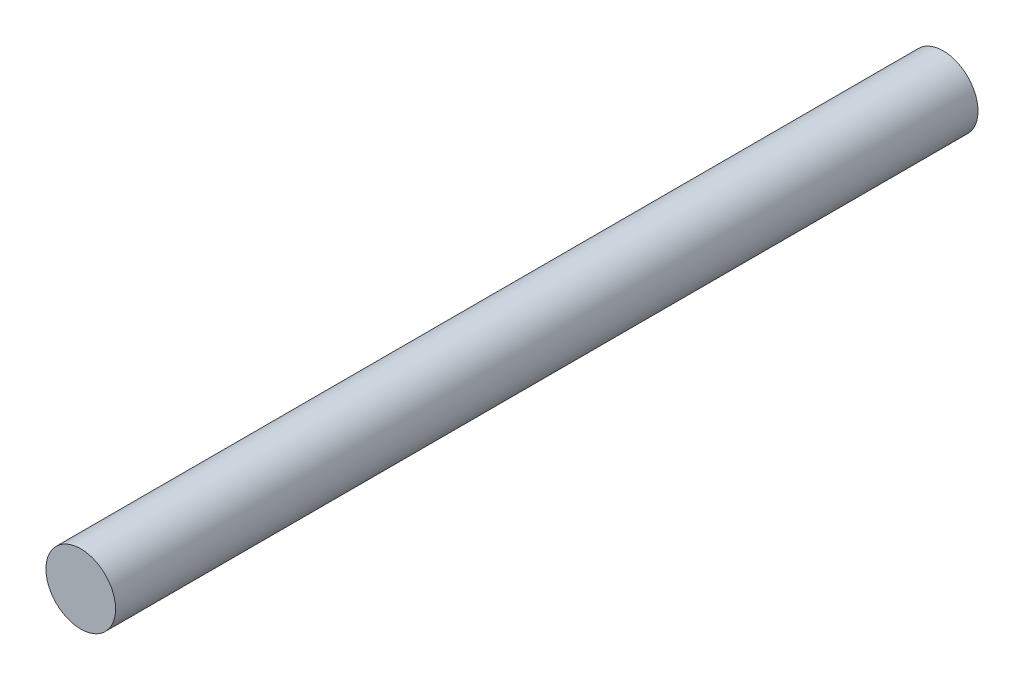
ISO-10303-21;
HEADER;
FILE_DESCRIPTION(('STEP AP214'),'2;1');
FILE_NAME('part.step','',(''),(''),'','','');
FILE_SCHEMA(('AUTOMOTIVE_DESIGN { 1 0 10303 214 1 1 1 1 }'));
ENDSEC;
DATA;
#1=APPLICATION_CONTEXT('core data for automotive mechanical design processes');
#2=APPLICATION_PROTOCOL_DEFINITION('international standard','automotive_design',2000,#1);
#3=PRODUCT_CONTEXT('',#1,'mechanical');
#4=PRODUCT('Part','Part','',(#3));
#5=PRODUCT_RELATED_PRODUCT_CATEGORY('part','',(#4));
#6=PRODUCT_DEFINITION_FORMATION('','',#4);
#7=PRODUCT_DEFINITION_CONTEXT('part definition',#1,'design');
#8=PRODUCT_DEFINITION('design','',#6,#7);
#9=PRODUCT_DEFINITION_SHAPE('','',#8);
#10=(LENGTH_UNIT() NAMED_UNIT(*) SI_UNIT(.MILLI.,.METRE.));
#11=(NAMED_UNIT(*) PLANE_ANGLE_UNIT() SI_UNIT($,.RADIAN.));
#12=(NAMED_UNIT(*) SI_UNIT($,.STERADIAN.) SOLID_ANGLE_UNIT());
#13=UNCERTAINTY_MEASURE_WITH_UNIT(LENGTH_MEASURE(1.E-05),#10,'distance_accuracy_value','');
#14=(GEOMETRIC_REPRESENTATION_CONTEXT(3) GLOBAL_UNCERTAINTY_ASSIGNED_CONTEXT((#13)) GLOBAL_UNIT_ASSIGNED_CONTEXT((#10,
#11,#12)) REPRESENTATION_CONTEXT('',''));
#15=CARTESIAN_POINT('',(0.,0.,0.));
#16=DIRECTION('',(0.,0.,1.));
#17=DIRECTION('',(1.,0.,0.));
#18=AXIS2_PLACEMENT_3D('',#15,#16,#17);
#19=CARTESIAN_POINT('',(0.,0.,73.1));
#20=DIRECTION('',(0.,0.,-1.));
#21=DIRECTION('',(-1.,0.,0.));
#22=AXIS2_PLACEMENT_3D('',#19,#20,#21);
#23=CYLINDRICAL_SURFACE('',#22,2.95);
#24=CARTESIAN_POINT('',(0.,0.,73.1));
#25=DIRECTION('',(0.,0.,1.));
#26=DIRECTION('',(1.,0.,0.));
#27=AXIS2_PLACEMENT_3D('',#24,#25,#26);
#28=CIRCLE('',#27,2.95);
#29=CARTESIAN_POINT('',(2.95,0.,73.1));
#30=VERTEX_POINT('',#29);
#31=EDGE_CURVE('E10',#30,#30,#28,.T.);
#32=ORIENTED_EDGE('',*,*,#31,.F.);
#33=EDGE_LOOP('',(#32));
#34=FACE_BOUND('',#33,.T.);
#35=CARTESIAN_POINT('',(0.,0.,0.));
#36=DIRECTION('',(0.,0.,1.));
#37=DIRECTION('',(1.,0.,0.));
#38=AXIS2_PLACEMENT_3D('',#35,#36,#37);
#39=CIRCLE('',#38,2.95);
#40=CARTESIAN_POINT('',(2.95,0.,0.));
#41=VERTEX_POINT('',#40);
#42=EDGE_CURVE('E33',#41,#41,#39,.T.);
#43=ORIENTED_EDGE('',*,*,#42,.T.);
#44=EDGE_LOOP('',(#43));
#45=FACE_BOUND('',#44,.T.);
#46=ADVANCED_FACE('F30',(#34,#45),#23,.T.);
#47=CARTESIAN_POINT('',(0.,0.,73.1));
#48=DIRECTION('',(0.,0.,1.));
#49=DIRECTION('',(1.,0.,0.));
#50=AXIS2_PLACEMENT_3D('',#47,#48,#49);
#51=PLANE('',#50);
#52=ORIENTED_EDGE('',*,*,#31,.T.);
#53=EDGE_LOOP('',(#52));
#54=FACE_BOUND('',#53,.T.);
#55=ADVANCED_FACE('F45',(#54),#51,.T.);
#56=CARTESIAN_POINT('',(0.,0.,0.));
#57=DIRECTION('',(0.,0.,1.));
#58=DIRECTION('',(1.,0.,0.));
#59=AXIS2_PLACEMENT_3D('',#56,#57,#58);
#60=PLANE('',#59);
#61=ORIENTED_EDGE('',*,*,#42,.F.);
#62=EDGE_LOOP('',(#61));
#63=FACE_BOUND('',#62,.T.);
#64=ADVANCED_FACE('F43',(#63),#60,.F.);
#65=CLOSED_SHELL('',(#46,#55,#64));
#66=MANIFOLD_SOLID_BREP('B2',#65);
#67=ADVANCED_BREP_SHAPE_REPRESENTATION('',(#18,#66),#14);
#68=SHAPE_DEFINITION_REPRESENTATION(#9,#67);
ENDSEC;
END-ISO-10303-21;
